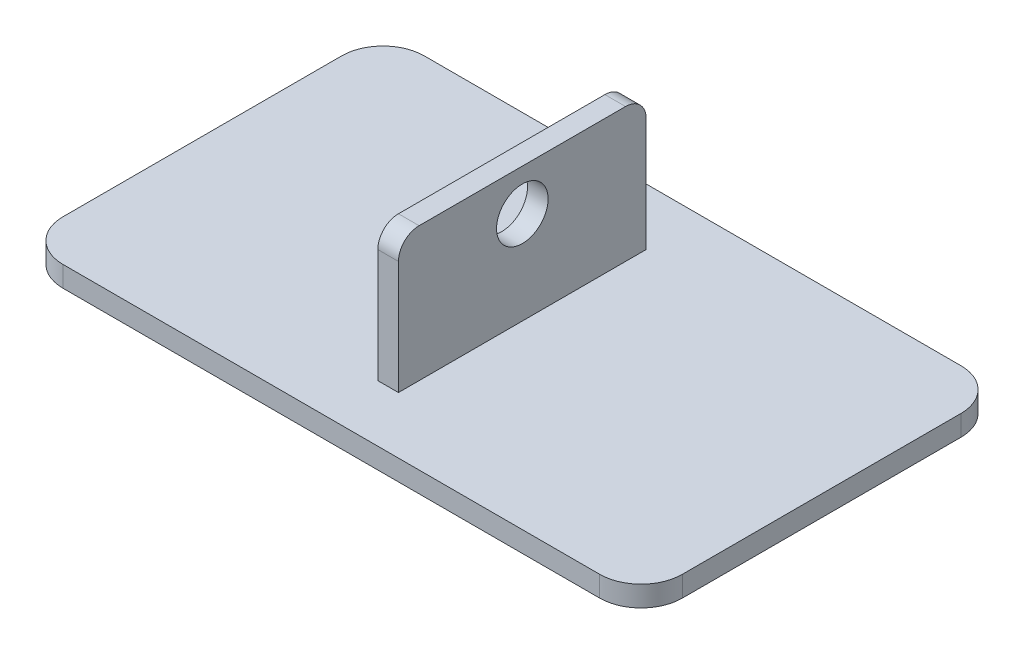
ISO-10303-21;
HEADER;
FILE_DESCRIPTION(('STEP AP214'),'2;1');
FILE_NAME('part.step','',(''),(''),'','','');
FILE_SCHEMA(('AUTOMOTIVE_DESIGN { 1 0 10303 214 1 1 1 1 }'));
ENDSEC;
DATA;
#1=APPLICATION_CONTEXT('core data for automotive mechanical design processes');
#2=APPLICATION_PROTOCOL_DEFINITION('international standard','automotive_design',2000,#1);
#3=PRODUCT_CONTEXT('',#1,'mechanical');
#4=PRODUCT('Part','Part','',(#3));
#5=PRODUCT_RELATED_PRODUCT_CATEGORY('part','',(#4));
#6=PRODUCT_DEFINITION_FORMATION('','',#4);
#7=PRODUCT_DEFINITION_CONTEXT('part definition',#1,'design');
#8=PRODUCT_DEFINITION('design','',#6,#7);
#9=PRODUCT_DEFINITION_SHAPE('','',#8);
#10=(LENGTH_UNIT() NAMED_UNIT(*) SI_UNIT(.MILLI.,.METRE.));
#11=(NAMED_UNIT(*) PLANE_ANGLE_UNIT() SI_UNIT($,.RADIAN.));
#12=(NAMED_UNIT(*) SI_UNIT($,.STERADIAN.) SOLID_ANGLE_UNIT());
#13=UNCERTAINTY_MEASURE_WITH_UNIT(LENGTH_MEASURE(1.E-05),#10,'distance_accuracy_value','');
#14=(GEOMETRIC_REPRESENTATION_CONTEXT(3) GLOBAL_UNCERTAINTY_ASSIGNED_CONTEXT((#13)) GLOBAL_UNIT_ASSIGNED_CONTEXT((#10,
#11,#12)) REPRESENTATION_CONTEXT('',''));
#15=CARTESIAN_POINT('',(0.,0.,0.));
#16=DIRECTION('',(0.,0.,1.));
#17=DIRECTION('',(1.,0.,0.));
#18=AXIS2_PLACEMENT_3D('',#15,#16,#17);
#19=CARTESIAN_POINT('',(0.,10.,0.));
#20=DIRECTION('',(0.,1.,0.));
#21=DIRECTION('',(0.,0.,1.));
#22=AXIS2_PLACEMENT_3D('',#19,#20,#21);
#23=PLANE('',#22);
#24=DIRECTION('',(-1.,0.,0.));
#25=VECTOR('',#24,1.);
#26=CARTESIAN_POINT('',(-150.,10.,-87.5));
#27=LINE('',#26,#25);
#28=CARTESIAN_POINT('',(130.,10.,-87.5));
#29=VERTEX_POINT('',#28);
#30=CARTESIAN_POINT('',(-130.,10.,-87.5));
#31=VERTEX_POINT('',#30);
#32=EDGE_CURVE('E195',#29,#31,#27,.T.);
#33=ORIENTED_EDGE('',*,*,#32,.T.);
#34=CARTESIAN_POINT('',(-130.,10.,-67.5));
#35=DIRECTION('',(0.,1.,0.));
#36=DIRECTION('',(0.,0.,1.));
#37=AXIS2_PLACEMENT_3D('',#34,#35,#36);
#38=CIRCLE('',#37,20.);
#39=CARTESIAN_POINT('',(-150.,10.,-67.5));
#40=VERTEX_POINT('',#39);
#41=EDGE_CURVE('E278',#31,#40,#38,.T.);
#42=ORIENTED_EDGE('',*,*,#41,.T.);
#43=DIRECTION('',(0.,0.,1.));
#44=VECTOR('',#43,1.);
#45=CARTESIAN_POINT('',(-150.,10.,-87.5));
#46=LINE('',#45,#44);
#47=CARTESIAN_POINT('',(-150.,10.,67.4999999999999));
#48=VERTEX_POINT('',#47);
#49=EDGE_CURVE('E200',#40,#48,#46,.T.);
#50=ORIENTED_EDGE('',*,*,#49,.T.);
#51=CARTESIAN_POINT('',(-130.,10.,67.5));
#52=DIRECTION('',(0.,1.,0.));
#53=DIRECTION('',(0.,0.,1.));
#54=AXIS2_PLACEMENT_3D('',#51,#52,#53);
#55=CIRCLE('',#54,20.);
#56=CARTESIAN_POINT('',(-130.,10.,87.5));
#57=VERTEX_POINT('',#56);
#58=EDGE_CURVE('E64',#48,#57,#55,.T.);
#59=ORIENTED_EDGE('',*,*,#58,.T.);
#60=DIRECTION('',(1.,0.,0.));
#61=VECTOR('',#60,1.);
#62=CARTESIAN_POINT('',(-150.,10.,87.5));
#63=LINE('',#62,#61);
#64=CARTESIAN_POINT('',(130.,10.,87.5));
#65=VERTEX_POINT('',#64);
#66=EDGE_CURVE('E203',#57,#65,#63,.T.);
#67=ORIENTED_EDGE('',*,*,#66,.T.);
#68=CARTESIAN_POINT('',(130.,10.,67.4999999999999));
#69=DIRECTION('',(0.,1.,0.));
#70=DIRECTION('',(0.,0.,1.));
#71=AXIS2_PLACEMENT_3D('',#68,#69,#70);
#72=CIRCLE('',#71,20.);
#73=CARTESIAN_POINT('',(150.,10.,67.4999999999999));
#74=VERTEX_POINT('',#73);
#75=EDGE_CURVE('E272',#65,#74,#72,.T.);
#76=ORIENTED_EDGE('',*,*,#75,.T.);
#77=DIRECTION('',(0.,0.,-1.));
#78=VECTOR('',#77,1.);
#79=CARTESIAN_POINT('',(150.,10.,-87.5));
#80=LINE('',#79,#78);
#81=CARTESIAN_POINT('',(150.,10.,-67.5));
#82=VERTEX_POINT('',#81);
#83=EDGE_CURVE('E191',#74,#82,#80,.T.);
#84=ORIENTED_EDGE('',*,*,#83,.T.);
#85=CARTESIAN_POINT('',(130.,10.,-67.5));
#86=DIRECTION('',(0.,1.,0.));
#87=DIRECTION('',(0.,0.,1.));
#88=AXIS2_PLACEMENT_3D('',#85,#86,#87);
#89=CIRCLE('',#88,20.);
#90=EDGE_CURVE('E275',#82,#29,#89,.T.);
#91=ORIENTED_EDGE('',*,*,#90,.T.);
#92=EDGE_LOOP('',(#33,#42,#50,#59,#67,#76,#84,#91));
#93=FACE_BOUND('',#92,.T.);
#94=DIRECTION('',(0.,0.,1.));
#95=VECTOR('',#94,1.);
#96=CARTESIAN_POINT('',(-5.00000000000006,10.,60.));
#97=LINE('',#96,#95);
#98=CARTESIAN_POINT('',(-5.00000000000008,10.,-60.));
#99=VERTEX_POINT('',#98);
#100=CARTESIAN_POINT('',(-5.00000000000006,10.,60.));
#101=VERTEX_POINT('',#100);
#102=EDGE_CURVE('E150',#99,#101,#97,.T.);
#103=ORIENTED_EDGE('',*,*,#102,.F.);
#104=DIRECTION('',(-1.,0.,0.));
#105=VECTOR('',#104,1.);
#106=CARTESIAN_POINT('',(-5.00000000000008,10.,-60.));
#107=LINE('',#106,#105);
#108=CARTESIAN_POINT('',(4.99999999999997,10.,-60.));
#109=VERTEX_POINT('',#108);
#110=EDGE_CURVE('E161',#109,#99,#107,.T.);
#111=ORIENTED_EDGE('',*,*,#110,.F.);
#112=DIRECTION('',(0.,0.,-1.));
#113=VECTOR('',#112,1.);
#114=CARTESIAN_POINT('',(5.,10.,60.));
#115=LINE('',#114,#113);
#116=CARTESIAN_POINT('',(5.,10.,60.));
#117=VERTEX_POINT('',#116);
#118=EDGE_CURVE('E176',#117,#109,#115,.T.);
#119=ORIENTED_EDGE('',*,*,#118,.F.);
#120=DIRECTION('',(1.,0.,0.));
#121=VECTOR('',#120,1.);
#122=CARTESIAN_POINT('',(-5.00000000000006,10.,60.));
#123=LINE('',#122,#121);
#124=EDGE_CURVE('E172',#101,#117,#123,.T.);
#125=ORIENTED_EDGE('',*,*,#124,.F.);
#126=EDGE_LOOP('',(#103,#111,#119,#125));
#127=FACE_BOUND('',#126,.T.);
#128=ADVANCED_FACE('F43',(#93,#127),#23,.T.);
#129=CARTESIAN_POINT('',(150.,10.,-87.5));
#130=DIRECTION('',(-1.,0.,0.));
#131=DIRECTION('',(0.,0.,1.));
#132=AXIS2_PLACEMENT_3D('',#129,#130,#131);
#133=PLANE('',#132);
#134=DIRECTION('',(0.,0.,-1.));
#135=VECTOR('',#134,1.);
#136=CARTESIAN_POINT('',(150.,0.,-87.5));
#137=LINE('',#136,#135);
#138=CARTESIAN_POINT('',(150.,0.,67.4999999999999));
#139=VERTEX_POINT('',#138);
#140=CARTESIAN_POINT('',(150.,0.,-67.5));
#141=VERTEX_POINT('',#140);
#142=EDGE_CURVE('E157',#139,#141,#137,.T.);
#143=ORIENTED_EDGE('',*,*,#142,.T.);
#144=DIRECTION('',(0.,-1.,0.));
#145=VECTOR('',#144,1.);
#146=CARTESIAN_POINT('',(150.,10.,-67.5));
#147=LINE('',#146,#145);
#148=EDGE_CURVE('E285',#141,#82,#147,.F.);
#149=ORIENTED_EDGE('',*,*,#148,.T.);
#150=ORIENTED_EDGE('',*,*,#83,.F.);
#151=DIRECTION('',(0.,-1.,0.));
#152=VECTOR('',#151,1.);
#153=CARTESIAN_POINT('',(150.,10.,67.4999999999999));
#154=LINE('',#153,#152);
#155=EDGE_CURVE('E281',#74,#139,#154,.T.);
#156=ORIENTED_EDGE('',*,*,#155,.T.);
#157=EDGE_LOOP('',(#143,#149,#150,#156));
#158=FACE_BOUND('',#157,.T.);
#159=ADVANCED_FACE('F303',(#158),#133,.F.);
#160=CARTESIAN_POINT('',(-150.,10.,-87.5));
#161=DIRECTION('',(0.,0.,1.));
#162=DIRECTION('',(1.,0.,0.));
#163=AXIS2_PLACEMENT_3D('',#160,#161,#162);
#164=PLANE('',#163);
#165=DIRECTION('',(-1.,0.,0.));
#166=VECTOR('',#165,1.);
#167=CARTESIAN_POINT('',(-150.,0.,-87.5));
#168=LINE('',#167,#166);
#169=CARTESIAN_POINT('',(130.,0.,-87.5));
#170=VERTEX_POINT('',#169);
#171=CARTESIAN_POINT('',(-130.,0.,-87.5));
#172=VERTEX_POINT('',#171);
#173=EDGE_CURVE('E210',#170,#172,#168,.T.);
#174=ORIENTED_EDGE('',*,*,#173,.T.);
#175=DIRECTION('',(0.,-1.,0.));
#176=VECTOR('',#175,1.);
#177=CARTESIAN_POINT('',(-130.,10.,-87.5));
#178=LINE('',#177,#176);
#179=EDGE_CURVE('E267',#172,#31,#178,.F.);
#180=ORIENTED_EDGE('',*,*,#179,.T.);
#181=ORIENTED_EDGE('',*,*,#32,.F.);
#182=DIRECTION('',(0.,-1.,0.));
#183=VECTOR('',#182,1.);
#184=CARTESIAN_POINT('',(130.,10.,-87.5));
#185=LINE('',#184,#183);
#186=EDGE_CURVE('E263',#29,#170,#185,.T.);
#187=ORIENTED_EDGE('',*,*,#186,.T.);
#188=EDGE_LOOP('',(#174,#180,#181,#187));
#189=FACE_BOUND('',#188,.T.);
#190=ADVANCED_FACE('F312',(#189),#164,.F.);
#191=CARTESIAN_POINT('',(-150.,10.,-87.5));
#192=DIRECTION('',(1.,0.,0.));
#193=DIRECTION('',(0.,0.,-1.));
#194=AXIS2_PLACEMENT_3D('',#191,#192,#193);
#195=PLANE('',#194);
#196=ORIENTED_EDGE('',*,*,#49,.F.);
#197=DIRECTION('',(0.,-1.,0.));
#198=VECTOR('',#197,1.);
#199=CARTESIAN_POINT('',(-150.,10.,-67.5));
#200=LINE('',#199,#198);
#201=CARTESIAN_POINT('',(-150.,0.,-67.5));
#202=VERTEX_POINT('',#201);
#203=EDGE_CURVE('E247',#40,#202,#200,.T.);
#204=ORIENTED_EDGE('',*,*,#203,.T.);
#205=DIRECTION('',(0.,0.,1.));
#206=VECTOR('',#205,1.);
#207=CARTESIAN_POINT('',(-150.,0.,-87.5));
#208=LINE('',#207,#206);
#209=CARTESIAN_POINT('',(-150.,0.,67.4999999999999));
#210=VERTEX_POINT('',#209);
#211=EDGE_CURVE('E214',#202,#210,#208,.T.);
#212=ORIENTED_EDGE('',*,*,#211,.T.);
#213=DIRECTION('',(0.,-1.,0.));
#214=VECTOR('',#213,1.);
#215=CARTESIAN_POINT('',(-150.,10.,67.4999999999999));
#216=LINE('',#215,#214);
#217=EDGE_CURVE('E244',#210,#48,#216,.F.);
#218=ORIENTED_EDGE('',*,*,#217,.T.);
#219=EDGE_LOOP('',(#196,#204,#212,#218));
#220=FACE_BOUND('',#219,.T.);
#221=ADVANCED_FACE('F320',(#220),#195,.F.);
#222=CARTESIAN_POINT('',(-150.,10.,87.5));
#223=DIRECTION('',(0.,0.,-1.));
#224=DIRECTION('',(-1.,0.,0.));
#225=AXIS2_PLACEMENT_3D('',#222,#223,#224);
#226=PLANE('',#225);
#227=DIRECTION('',(1.,0.,0.));
#228=VECTOR('',#227,1.);
#229=CARTESIAN_POINT('',(-150.,0.,87.5));
#230=LINE('',#229,#228);
#231=CARTESIAN_POINT('',(-130.,0.,87.5));
#232=VERTEX_POINT('',#231);
#233=CARTESIAN_POINT('',(130.,0.,87.5));
#234=VERTEX_POINT('',#233);
#235=EDGE_CURVE('E196',#232,#234,#230,.T.);
#236=ORIENTED_EDGE('',*,*,#235,.T.);
#237=DIRECTION('',(0.,-1.,0.));
#238=VECTOR('',#237,1.);
#239=CARTESIAN_POINT('',(130.,10.,87.5));
#240=LINE('',#239,#238);
#241=EDGE_CURVE('E11',#234,#65,#240,.F.);
#242=ORIENTED_EDGE('',*,*,#241,.T.);
#243=ORIENTED_EDGE('',*,*,#66,.F.);
#244=DIRECTION('',(0.,-1.,0.));
#245=VECTOR('',#244,1.);
#246=CARTESIAN_POINT('',(-130.,10.,87.5));
#247=LINE('',#246,#245);
#248=EDGE_CURVE('E52',#57,#232,#247,.T.);
#249=ORIENTED_EDGE('',*,*,#248,.T.);
#250=EDGE_LOOP('',(#236,#242,#243,#249));
#251=FACE_BOUND('',#250,.T.);
#252=ADVANCED_FACE('F291',(#251),#226,.F.);
#253=CARTESIAN_POINT('',(0.,0.,0.));
#254=DIRECTION('',(0.,1.,0.));
#255=DIRECTION('',(0.,0.,1.));
#256=AXIS2_PLACEMENT_3D('',#253,#254,#255);
#257=PLANE('',#256);
#258=ORIENTED_EDGE('',*,*,#211,.F.);
#259=CARTESIAN_POINT('',(-130.,0.,-67.5));
#260=DIRECTION('',(0.,1.,0.));
#261=DIRECTION('',(0.,0.,1.));
#262=AXIS2_PLACEMENT_3D('',#259,#260,#261);
#263=CIRCLE('',#262,20.);
#264=EDGE_CURVE('E260',#202,#172,#263,.F.);
#265=ORIENTED_EDGE('',*,*,#264,.T.);
#266=ORIENTED_EDGE('',*,*,#173,.F.);
#267=CARTESIAN_POINT('',(130.,0.,-67.5));
#268=DIRECTION('',(0.,1.,0.));
#269=DIRECTION('',(0.,0.,1.));
#270=AXIS2_PLACEMENT_3D('',#267,#268,#269);
#271=CIRCLE('',#270,20.);
#272=EDGE_CURVE('E257',#170,#141,#271,.F.);
#273=ORIENTED_EDGE('',*,*,#272,.T.);
#274=ORIENTED_EDGE('',*,*,#142,.F.);
#275=CARTESIAN_POINT('',(130.,0.,67.4999999999999));
#276=DIRECTION('',(0.,1.,0.));
#277=DIRECTION('',(0.,0.,1.));
#278=AXIS2_PLACEMENT_3D('',#275,#276,#277);
#279=CIRCLE('',#278,20.);
#280=EDGE_CURVE('E254',#139,#234,#279,.F.);
#281=ORIENTED_EDGE('',*,*,#280,.T.);
#282=ORIENTED_EDGE('',*,*,#235,.F.);
#283=CARTESIAN_POINT('',(-130.,0.,67.5));
#284=DIRECTION('',(0.,1.,0.));
#285=DIRECTION('',(0.,0.,1.));
#286=AXIS2_PLACEMENT_3D('',#283,#284,#285);
#287=CIRCLE('',#286,20.);
#288=EDGE_CURVE('E251',#232,#210,#287,.F.);
#289=ORIENTED_EDGE('',*,*,#288,.T.);
#290=EDGE_LOOP('',(#258,#265,#266,#273,#274,#281,#282,#289));
#291=FACE_BOUND('',#290,.T.);
#292=ADVANCED_FACE('F295',(#291),#257,.F.);
#293=CARTESIAN_POINT('',(-5.00000000000008,75.,-60.));
#294=DIRECTION('',(0.,0.,1.));
#295=DIRECTION('',(1.,0.,0.));
#296=AXIS2_PLACEMENT_3D('',#293,#294,#295);
#297=PLANE('',#296);
#298=DIRECTION('',(0.,-1.,0.));
#299=VECTOR('',#298,1.);
#300=CARTESIAN_POINT('',(-5.00000000000008,75.,-60.));
#301=LINE('',#300,#299);
#302=CARTESIAN_POINT('',(-5.00000000000008,65.,-60.));
#303=VERTEX_POINT('',#302);
#304=EDGE_CURVE('E145',#303,#99,#301,.T.);
#305=ORIENTED_EDGE('',*,*,#304,.F.);
#306=DIRECTION('',(-1.,0.,0.));
#307=VECTOR('',#306,1.);
#308=CARTESIAN_POINT('',(4.99999999999997,65.,-60.));
#309=LINE('',#308,#307);
#310=CARTESIAN_POINT('',(4.99999999999997,65.,-60.));
#311=VERTEX_POINT('',#310);
#312=EDGE_CURVE('E241',#303,#311,#309,.F.);
#313=ORIENTED_EDGE('',*,*,#312,.T.);
#314=DIRECTION('',(0.,-1.,0.));
#315=VECTOR('',#314,1.);
#316=CARTESIAN_POINT('',(4.99999999999997,75.,-60.));
#317=LINE('',#316,#315);
#318=EDGE_CURVE('E164',#311,#109,#317,.T.);
#319=ORIENTED_EDGE('',*,*,#318,.T.);
#320=ORIENTED_EDGE('',*,*,#110,.T.);
#321=EDGE_LOOP('',(#305,#313,#319,#320));
#322=FACE_BOUND('',#321,.T.);
#323=ADVANCED_FACE('F162',(#322),#297,.F.);
#324=CARTESIAN_POINT('',(-5.00000000000006,75.,60.));
#325=DIRECTION('',(1.,0.,0.));
#326=DIRECTION('',(0.,0.,-1.));
#327=AXIS2_PLACEMENT_3D('',#324,#325,#326);
#328=PLANE('',#327);
#329=CARTESIAN_POINT('',(-5.00000000000001,55.,0.));
#330=DIRECTION('',(1.,0.,0.));
#331=DIRECTION('',(0.,0.,-1.));
#332=AXIS2_PLACEMENT_3D('',#329,#330,#331);
#333=CIRCLE('',#332,12.5);
#334=CARTESIAN_POINT('',(-5.00000000000002,55.,-12.5));
#335=VERTEX_POINT('',#334);
#336=EDGE_CURVE('E169',#335,#335,#333,.T.);
#337=ORIENTED_EDGE('',*,*,#336,.T.);
#338=EDGE_LOOP('',(#337));
#339=FACE_BOUND('',#338,.T.);
#340=DIRECTION('',(0.,-1.,0.));
#341=VECTOR('',#340,1.);
#342=CARTESIAN_POINT('',(-5.00000000000006,75.,60.));
#343=LINE('',#342,#341);
#344=CARTESIAN_POINT('',(-5.00000000000006,65.,60.));
#345=VERTEX_POINT('',#344);
#346=EDGE_CURVE('E158',#345,#101,#343,.T.);
#347=ORIENTED_EDGE('',*,*,#346,.F.);
#348=CARTESIAN_POINT('',(-5.00000000000006,65.,50.));
#349=DIRECTION('',(1.,0.,0.));
#350=DIRECTION('',(0.,0.,-1.));
#351=AXIS2_PLACEMENT_3D('',#348,#349,#350);
#352=CIRCLE('',#351,10.);
#353=CARTESIAN_POINT('',(-5.00000000000006,75.,50.));
#354=VERTEX_POINT('',#353);
#355=EDGE_CURVE('E238',#345,#354,#352,.F.);
#356=ORIENTED_EDGE('',*,*,#355,.T.);
#357=DIRECTION('',(0.,0.,1.));
#358=VECTOR('',#357,1.);
#359=CARTESIAN_POINT('',(-5.00000000000006,75.,60.));
#360=LINE('',#359,#358);
#361=CARTESIAN_POINT('',(-5.00000000000008,75.,-50.));
#362=VERTEX_POINT('',#361);
#363=EDGE_CURVE('E182',#362,#354,#360,.T.);
#364=ORIENTED_EDGE('',*,*,#363,.F.);
#365=CARTESIAN_POINT('',(-5.00000000000008,65.,-50.));
#366=DIRECTION('',(1.,0.,0.));
#367=DIRECTION('',(0.,0.,-1.));
#368=AXIS2_PLACEMENT_3D('',#365,#366,#367);
#369=CIRCLE('',#368,10.);
#370=EDGE_CURVE('E153',#362,#303,#369,.F.);
#371=ORIENTED_EDGE('',*,*,#370,.T.);
#372=ORIENTED_EDGE('',*,*,#304,.T.);
#373=ORIENTED_EDGE('',*,*,#102,.T.);
#374=EDGE_LOOP('',(#347,#356,#364,#371,#372,#373));
#375=FACE_BOUND('',#374,.T.);
#376=ADVANCED_FACE('F148',(#339,#375),#328,.F.);
#377=CARTESIAN_POINT('',(-5.00000000000006,75.,60.));
#378=DIRECTION('',(0.,0.,-1.));
#379=DIRECTION('',(-1.,0.,0.));
#380=AXIS2_PLACEMENT_3D('',#377,#378,#379);
#381=PLANE('',#380);
#382=DIRECTION('',(0.,-1.,0.));
#383=VECTOR('',#382,1.);
#384=CARTESIAN_POINT('',(5.,75.,60.));
#385=LINE('',#384,#383);
#386=CARTESIAN_POINT('',(5.,65.,60.));
#387=VERTEX_POINT('',#386);
#388=EDGE_CURVE('E185',#387,#117,#385,.T.);
#389=ORIENTED_EDGE('',*,*,#388,.F.);
#390=DIRECTION('',(1.,0.,0.));
#391=VECTOR('',#390,1.);
#392=CARTESIAN_POINT('',(-5.00000000000006,65.,60.));
#393=LINE('',#392,#391);
#394=EDGE_CURVE('E233',#387,#345,#393,.F.);
#395=ORIENTED_EDGE('',*,*,#394,.T.);
#396=ORIENTED_EDGE('',*,*,#346,.T.);
#397=ORIENTED_EDGE('',*,*,#124,.T.);
#398=EDGE_LOOP('',(#389,#395,#396,#397));
#399=FACE_BOUND('',#398,.T.);
#400=ADVANCED_FACE('F421',(#399),#381,.F.);
#401=CARTESIAN_POINT('',(5.,75.,60.));
#402=DIRECTION('',(-1.,0.,0.));
#403=DIRECTION('',(0.,0.,1.));
#404=AXIS2_PLACEMENT_3D('',#401,#402,#403);
#405=PLANE('',#404);
#406=CARTESIAN_POINT('',(4.99999999999999,55.,0.));
#407=DIRECTION('',(1.,0.,0.));
#408=DIRECTION('',(0.,0.,-1.));
#409=AXIS2_PLACEMENT_3D('',#406,#407,#408);
#410=CIRCLE('',#409,12.5);
#411=CARTESIAN_POINT('',(4.99999999999998,55.,-12.5));
#412=VERTEX_POINT('',#411);
#413=EDGE_CURVE('E516',#412,#412,#410,.T.);
#414=ORIENTED_EDGE('',*,*,#413,.F.);
#415=EDGE_LOOP('',(#414));
#416=FACE_BOUND('',#415,.T.);
#417=DIRECTION('',(0.,0.,-1.));
#418=VECTOR('',#417,1.);
#419=CARTESIAN_POINT('',(5.,75.,60.));
#420=LINE('',#419,#418);
#421=CARTESIAN_POINT('',(5.,75.,50.));
#422=VERTEX_POINT('',#421);
#423=CARTESIAN_POINT('',(4.99999999999998,75.,-50.));
#424=VERTEX_POINT('',#423);
#425=EDGE_CURVE('E186',#422,#424,#420,.T.);
#426=ORIENTED_EDGE('',*,*,#425,.F.);
#427=CARTESIAN_POINT('',(5.,65.,50.));
#428=DIRECTION('',(-1.,0.,0.));
#429=DIRECTION('',(0.,0.,1.));
#430=AXIS2_PLACEMENT_3D('',#427,#428,#429);
#431=CIRCLE('',#430,10.);
#432=EDGE_CURVE('E230',#422,#387,#431,.F.);
#433=ORIENTED_EDGE('',*,*,#432,.T.);
#434=ORIENTED_EDGE('',*,*,#388,.T.);
#435=ORIENTED_EDGE('',*,*,#118,.T.);
#436=ORIENTED_EDGE('',*,*,#318,.F.);
#437=CARTESIAN_POINT('',(4.99999999999998,65.,-50.));
#438=DIRECTION('',(-1.,0.,0.));
#439=DIRECTION('',(0.,0.,1.));
#440=AXIS2_PLACEMENT_3D('',#437,#438,#439);
#441=CIRCLE('',#440,10.);
#442=EDGE_CURVE('E227',#311,#424,#441,.F.);
#443=ORIENTED_EDGE('',*,*,#442,.T.);
#444=EDGE_LOOP('',(#426,#433,#434,#435,#436,#443));
#445=FACE_BOUND('',#444,.T.);
#446=ADVANCED_FACE('F411',(#416,#445),#405,.F.);
#447=CARTESIAN_POINT('',(0.,75.,0.));
#448=DIRECTION('',(0.,1.,0.));
#449=DIRECTION('',(0.,0.,1.));
#450=AXIS2_PLACEMENT_3D('',#447,#448,#449);
#451=PLANE('',#450);
#452=ORIENTED_EDGE('',*,*,#363,.T.);
#453=DIRECTION('',(1.,0.,0.));
#454=VECTOR('',#453,1.);
#455=CARTESIAN_POINT('',(5.,75.,50.));
#456=LINE('',#455,#454);
#457=EDGE_CURVE('E223',#354,#422,#456,.T.);
#458=ORIENTED_EDGE('',*,*,#457,.T.);
#459=ORIENTED_EDGE('',*,*,#425,.T.);
#460=DIRECTION('',(-1.,0.,0.));
#461=VECTOR('',#460,1.);
#462=CARTESIAN_POINT('',(-5.00000000000007,75.,-50.));
#463=LINE('',#462,#461);
#464=EDGE_CURVE('E206',#424,#362,#463,.T.);
#465=ORIENTED_EDGE('',*,*,#464,.T.);
#466=EDGE_LOOP('',(#452,#458,#459,#465));
#467=FACE_BOUND('',#466,.T.);
#468=ADVANCED_FACE('F401',(#467),#451,.T.);
#469=CARTESIAN_POINT('',(-5.00000000000001,55.,0.));
#470=DIRECTION('',(1.,0.,0.));
#471=DIRECTION('',(0.,0.,-1.));
#472=AXIS2_PLACEMENT_3D('',#469,#470,#471);
#473=CYLINDRICAL_SURFACE('',#472,12.5);
#474=ORIENTED_EDGE('',*,*,#336,.F.);
#475=EDGE_LOOP('',(#474));
#476=FACE_BOUND('',#475,.T.);
#477=ORIENTED_EDGE('',*,*,#413,.T.);
#478=EDGE_LOOP('',(#477));
#479=FACE_BOUND('',#478,.T.);
#480=ADVANCED_FACE('F347',(#476,#479),#473,.F.);
#481=CARTESIAN_POINT('',(0.,65.,50.));
#482=DIRECTION('',(-1.,0.,0.));
#483=DIRECTION('',(0.,0.,1.));
#484=AXIS2_PLACEMENT_3D('',#481,#482,#483);
#485=CYLINDRICAL_SURFACE('',#484,10.);
#486=ORIENTED_EDGE('',*,*,#355,.F.);
#487=ORIENTED_EDGE('',*,*,#394,.F.);
#488=ORIENTED_EDGE('',*,*,#432,.F.);
#489=ORIENTED_EDGE('',*,*,#457,.F.);
#490=EDGE_LOOP('',(#486,#487,#488,#489));
#491=FACE_BOUND('',#490,.T.);
#492=ADVANCED_FACE('F343',(#491),#485,.T.);
#493=CARTESIAN_POINT('',(0.,65.,-50.));
#494=DIRECTION('',(1.,0.,0.));
#495=DIRECTION('',(0.,0.,-1.));
#496=AXIS2_PLACEMENT_3D('',#493,#494,#495);
#497=CYLINDRICAL_SURFACE('',#496,10.);
#498=ORIENTED_EDGE('',*,*,#442,.F.);
#499=ORIENTED_EDGE('',*,*,#312,.F.);
#500=ORIENTED_EDGE('',*,*,#370,.F.);
#501=ORIENTED_EDGE('',*,*,#464,.F.);
#502=EDGE_LOOP('',(#498,#499,#500,#501));
#503=FACE_BOUND('',#502,.T.);
#504=ADVANCED_FACE('F346',(#503),#497,.T.);
#505=CARTESIAN_POINT('',(-130.,10.,-67.5));
#506=DIRECTION('',(0.,-1.,0.));
#507=DIRECTION('',(0.,0.,-1.));
#508=AXIS2_PLACEMENT_3D('',#505,#506,#507);
#509=CYLINDRICAL_SURFACE('',#508,20.);
#510=ORIENTED_EDGE('',*,*,#41,.F.);
#511=ORIENTED_EDGE('',*,*,#179,.F.);
#512=ORIENTED_EDGE('',*,*,#264,.F.);
#513=ORIENTED_EDGE('',*,*,#203,.F.);
#514=EDGE_LOOP('',(#510,#511,#512,#513));
#515=FACE_BOUND('',#514,.T.);
#516=ADVANCED_FACE('F317',(#515),#509,.T.);
#517=CARTESIAN_POINT('',(130.,10.,-67.5));
#518=DIRECTION('',(0.,-1.,0.));
#519=DIRECTION('',(0.,0.,-1.));
#520=AXIS2_PLACEMENT_3D('',#517,#518,#519);
#521=CYLINDRICAL_SURFACE('',#520,20.);
#522=ORIENTED_EDGE('',*,*,#90,.F.);
#523=ORIENTED_EDGE('',*,*,#148,.F.);
#524=ORIENTED_EDGE('',*,*,#272,.F.);
#525=ORIENTED_EDGE('',*,*,#186,.F.);
#526=EDGE_LOOP('',(#522,#523,#524,#525));
#527=FACE_BOUND('',#526,.T.);
#528=ADVANCED_FACE('F309',(#527),#521,.T.);
#529=CARTESIAN_POINT('',(130.,10.,67.4999999999999));
#530=DIRECTION('',(0.,-1.,0.));
#531=DIRECTION('',(0.,0.,-1.));
#532=AXIS2_PLACEMENT_3D('',#529,#530,#531);
#533=CYLINDRICAL_SURFACE('',#532,20.);
#534=ORIENTED_EDGE('',*,*,#75,.F.);
#535=ORIENTED_EDGE('',*,*,#241,.F.);
#536=ORIENTED_EDGE('',*,*,#280,.F.);
#537=ORIENTED_EDGE('',*,*,#155,.F.);
#538=EDGE_LOOP('',(#534,#535,#536,#537));
#539=FACE_BOUND('',#538,.T.);
#540=ADVANCED_FACE('F300',(#539),#533,.T.);
#541=CARTESIAN_POINT('',(-130.,10.,67.5));
#542=DIRECTION('',(0.,-1.,0.));
#543=DIRECTION('',(0.,0.,-1.));
#544=AXIS2_PLACEMENT_3D('',#541,#542,#543);
#545=CYLINDRICAL_SURFACE('',#544,20.);
#546=ORIENTED_EDGE('',*,*,#58,.F.);
#547=ORIENTED_EDGE('',*,*,#217,.F.);
#548=ORIENTED_EDGE('',*,*,#288,.F.);
#549=ORIENTED_EDGE('',*,*,#248,.F.);
#550=EDGE_LOOP('',(#546,#547,#548,#549));
#551=FACE_BOUND('',#550,.T.);
#552=ADVANCED_FACE('F45',(#551),#545,.T.);
#553=CLOSED_SHELL('',(#128,#159,#190,#221,#252,#292,#323,#376,#400,#446,#468,#480,#492,#504,
#516,#528,#540,#552));
#554=MANIFOLD_SOLID_BREP('B2',#553);
#555=ADVANCED_BREP_SHAPE_REPRESENTATION('',(#18,#554),#14);
#556=SHAPE_DEFINITION_REPRESENTATION(#9,#555);
ENDSEC;
END-ISO-10303-21;
